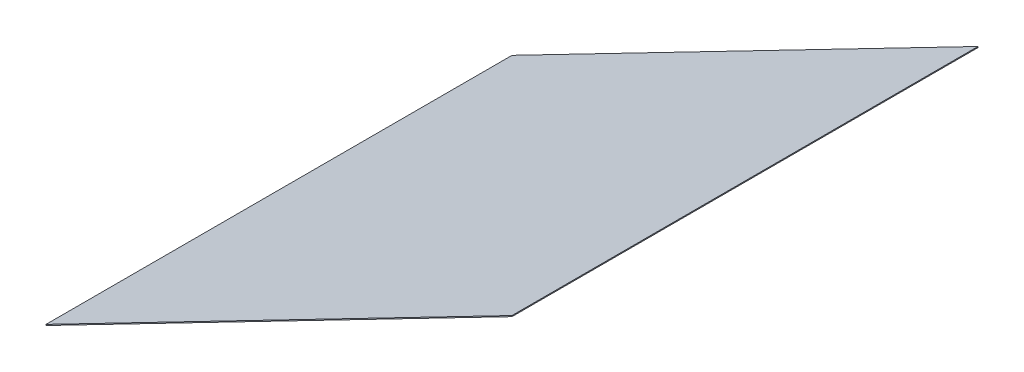
ISO-10303-21;
HEADER;
FILE_DESCRIPTION(('STEP AP214'),'2;1');
FILE_NAME('part.step','',(''),(''),'','','');
FILE_SCHEMA(('AUTOMOTIVE_DESIGN { 1 0 10303 214 1 1 1 1 }'));
ENDSEC;
DATA;
#1=APPLICATION_CONTEXT('core data for automotive mechanical design processes');
#2=APPLICATION_PROTOCOL_DEFINITION('international standard','automotive_design',2000,#1);
#3=PRODUCT_CONTEXT('',#1,'mechanical');
#4=PRODUCT('Part','Part','',(#3));
#5=PRODUCT_RELATED_PRODUCT_CATEGORY('part','',(#4));
#6=PRODUCT_DEFINITION_FORMATION('','',#4);
#7=PRODUCT_DEFINITION_CONTEXT('part definition',#1,'design');
#8=PRODUCT_DEFINITION('design','',#6,#7);
#9=PRODUCT_DEFINITION_SHAPE('','',#8);
#10=(LENGTH_UNIT() NAMED_UNIT(*) SI_UNIT(.MILLI.,.METRE.));
#11=(NAMED_UNIT(*) PLANE_ANGLE_UNIT() SI_UNIT($,.RADIAN.));
#12=(NAMED_UNIT(*) SI_UNIT($,.STERADIAN.) SOLID_ANGLE_UNIT());
#13=UNCERTAINTY_MEASURE_WITH_UNIT(LENGTH_MEASURE(1.E-05),#10,'distance_accuracy_value','');
#14=(GEOMETRIC_REPRESENTATION_CONTEXT(3) GLOBAL_UNCERTAINTY_ASSIGNED_CONTEXT((#13)) GLOBAL_UNIT_ASSIGNED_CONTEXT((#10,
#11,#12)) REPRESENTATION_CONTEXT('',''));
#15=CARTESIAN_POINT('',(0.,0.,0.));
#16=DIRECTION('',(0.,0.,1.));
#17=DIRECTION('',(1.,0.,0.));
#18=AXIS2_PLACEMENT_3D('',#15,#16,#17);
#19=CARTESIAN_POINT('',(0.,50.8,-12192.));
#20=DIRECTION('',(1.,0.,0.));
#21=DIRECTION('',(0.,0.,-1.));
#22=AXIS2_PLACEMENT_3D('',#19,#20,#21);
#23=PLANE('',#22);
#24=DIRECTION('',(0.,0.,-1.));
#25=VECTOR('',#24,1.);
#26=CARTESIAN_POINT('',(0.,4598.23678906917,-26022.0350141595));
#27=LINE('',#26,#25);
#28=CARTESIAN_POINT('',(0.,4598.23678906917,0.));
#29=VERTEX_POINT('',#28);
#30=CARTESIAN_POINT('',(0.,4598.23678906917,-12192.));
#31=VERTEX_POINT('',#30);
#32=EDGE_CURVE('E86',#29,#31,#27,.T.);
#33=ORIENTED_EDGE('',*,*,#32,.T.);
#34=DIRECTION('',(0.,-1.,0.));
#35=VECTOR('',#34,1.);
#36=CARTESIAN_POINT('',(0.,50.8,-12192.));
#37=LINE('',#36,#35);
#38=CARTESIAN_POINT('',(4.7679880361686E-12,4572.,-12192.));
#39=VERTEX_POINT('',#38);
#40=EDGE_CURVE('E37',#31,#39,#37,.T.);
#41=ORIENTED_EDGE('',*,*,#40,.T.);
#42=DIRECTION('',(0.,0.,-1.));
#43=VECTOR('',#42,1.);
#44=CARTESIAN_POINT('',(0.,4572.,-12192.));
#45=LINE('',#44,#43);
#46=CARTESIAN_POINT('',(0.,4572.,0.));
#47=VERTEX_POINT('',#46);
#48=EDGE_CURVE('E77',#47,#39,#45,.T.);
#49=ORIENTED_EDGE('',*,*,#48,.F.);
#50=DIRECTION('',(0.,-1.,0.));
#51=VECTOR('',#50,1.);
#52=CARTESIAN_POINT('',(0.,50.8,0.));
#53=LINE('',#52,#51);
#54=EDGE_CURVE('E92',#29,#47,#53,.T.);
#55=ORIENTED_EDGE('',*,*,#54,.F.);
#56=EDGE_LOOP('',(#33,#41,#49,#55));
#57=FACE_BOUND('',#56,.T.);
#58=ADVANCED_FACE('F34',(#57),#23,.F.);
#59=CARTESIAN_POINT('',(12192.,10868.8293766007,-12192.));
#60=DIRECTION('',(0.,0.,1.));
#61=DIRECTION('',(1.,0.,0.));
#62=AXIS2_PLACEMENT_3D('',#59,#60,#61);
#63=PLANE('',#62);
#64=DIRECTION('',(0.888496348848055,0.458883686879013,0.));
#65=VECTOR('',#64,1.);
#66=CARTESIAN_POINT('',(0.,4572.,-12192.));
#67=LINE('',#66,#65);
#68=CARTESIAN_POINT('',(12192.,10868.8293766007,-12192.));
#69=VERTEX_POINT('',#68);
#70=EDGE_CURVE('E81',#39,#69,#67,.T.);
#71=ORIENTED_EDGE('',*,*,#70,.F.);
#72=ORIENTED_EDGE('',*,*,#40,.F.);
#73=DIRECTION('',(0.888496348848055,0.458883686879013,0.));
#74=VECTOR('',#73,1.);
#75=CARTESIAN_POINT('',(-50.8,4572.,-12192.));
#76=LINE('',#75,#74);
#77=CARTESIAN_POINT('',(12192.,10895.0661656699,-12192.));
#78=VERTEX_POINT('',#77);
#79=EDGE_CURVE('E96',#31,#78,#76,.T.);
#80=ORIENTED_EDGE('',*,*,#79,.T.);
#81=DIRECTION('',(0.,1.,0.));
#82=VECTOR('',#81,1.);
#83=CARTESIAN_POINT('',(12192.,50.8,-12192.));
#84=LINE('',#83,#82);
#85=EDGE_CURVE('E91',#69,#78,#84,.T.);
#86=ORIENTED_EDGE('',*,*,#85,.F.);
#87=EDGE_LOOP('',(#71,#72,#80,#86));
#88=FACE_BOUND('',#87,.T.);
#89=ADVANCED_FACE('F90',(#88),#63,.F.);
#90=CARTESIAN_POINT('',(12192.,50.8,0.));
#91=DIRECTION('',(-1.,0.,0.));
#92=DIRECTION('',(0.,0.,1.));
#93=AXIS2_PLACEMENT_3D('',#90,#91,#92);
#94=PLANE('',#93);
#95=DIRECTION('',(0.,0.,1.));
#96=VECTOR('',#95,1.);
#97=CARTESIAN_POINT('',(12192.,10868.8293766007,-26022.0350141595));
#98=LINE('',#97,#96);
#99=CARTESIAN_POINT('',(12192.,10868.8293766007,0.));
#100=VERTEX_POINT('',#99);
#101=EDGE_CURVE('E50',#69,#100,#98,.T.);
#102=ORIENTED_EDGE('',*,*,#101,.F.);
#103=ORIENTED_EDGE('',*,*,#85,.T.);
#104=DIRECTION('',(0.,0.,1.));
#105=VECTOR('',#104,1.);
#106=CARTESIAN_POINT('',(12192.,10895.0661656699,-26022.0350141595));
#107=LINE('',#106,#105);
#108=CARTESIAN_POINT('',(12192.,10895.0661656699,0.));
#109=VERTEX_POINT('',#108);
#110=EDGE_CURVE('E58',#78,#109,#107,.T.);
#111=ORIENTED_EDGE('',*,*,#110,.T.);
#112=DIRECTION('',(0.,1.,0.));
#113=VECTOR('',#112,1.);
#114=CARTESIAN_POINT('',(12192.,10868.8293766007,0.));
#115=LINE('',#114,#113);
#116=EDGE_CURVE('E101',#100,#109,#115,.T.);
#117=ORIENTED_EDGE('',*,*,#116,.F.);
#118=EDGE_LOOP('',(#102,#103,#111,#117));
#119=FACE_BOUND('',#118,.T.);
#120=ADVANCED_FACE('F106',(#119),#94,.F.);
#121=CARTESIAN_POINT('',(0.,50.8,0.));
#122=DIRECTION('',(0.,0.,-1.));
#123=DIRECTION('',(-1.,0.,0.));
#124=AXIS2_PLACEMENT_3D('',#121,#122,#123);
#125=PLANE('',#124);
#126=DIRECTION('',(-0.888496348848055,-0.458883686879013,0.));
#127=VECTOR('',#126,1.);
#128=CARTESIAN_POINT('',(-50.8,4572.,0.));
#129=LINE('',#128,#127);
#130=EDGE_CURVE('E11',#109,#29,#129,.T.);
#131=ORIENTED_EDGE('',*,*,#130,.T.);
#132=ORIENTED_EDGE('',*,*,#54,.T.);
#133=DIRECTION('',(0.888496348848055,0.458883686879013,0.));
#134=VECTOR('',#133,1.);
#135=CARTESIAN_POINT('',(0.,4572.,0.));
#136=LINE('',#135,#134);
#137=EDGE_CURVE('E42',#47,#100,#136,.T.);
#138=ORIENTED_EDGE('',*,*,#137,.T.);
#139=ORIENTED_EDGE('',*,*,#116,.T.);
#140=EDGE_LOOP('',(#131,#132,#138,#139));
#141=FACE_BOUND('',#140,.T.);
#142=ADVANCED_FACE('F105',(#141),#125,.F.);
#143=CARTESIAN_POINT('',(-50.8,4572.,-26022.0350141595));
#144=DIRECTION('',(-0.458883686879013,0.888496348848055,0.));
#145=DIRECTION('',(-0.888496348848055,-0.458883686879013,0.));
#146=AXIS2_PLACEMENT_3D('',#143,#144,#145);
#147=PLANE('',#146);
#148=ORIENTED_EDGE('',*,*,#79,.F.);
#149=ORIENTED_EDGE('',*,*,#32,.F.);
#150=ORIENTED_EDGE('',*,*,#130,.F.);
#151=ORIENTED_EDGE('',*,*,#110,.F.);
#152=EDGE_LOOP('',(#148,#149,#150,#151));
#153=FACE_BOUND('',#152,.T.);
#154=ADVANCED_FACE('F108',(#153),#147,.T.);
#155=CARTESIAN_POINT('',(0.,4572.,-26022.0350141595));
#156=DIRECTION('',(0.458883686879013,-0.888496348848055,0.));
#157=DIRECTION('',(0.888496348848055,0.458883686879013,0.));
#158=AXIS2_PLACEMENT_3D('',#155,#156,#157);
#159=PLANE('',#158);
#160=ORIENTED_EDGE('',*,*,#48,.T.);
#161=ORIENTED_EDGE('',*,*,#70,.T.);
#162=ORIENTED_EDGE('',*,*,#101,.T.);
#163=ORIENTED_EDGE('',*,*,#137,.F.);
#164=EDGE_LOOP('',(#160,#161,#162,#163));
#165=FACE_BOUND('',#164,.T.);
#166=ADVANCED_FACE('F79',(#165),#159,.T.);
#167=CLOSED_SHELL('',(#58,#89,#120,#142,#154,#166));
#168=MANIFOLD_SOLID_BREP('B2',#167);
#169=ADVANCED_BREP_SHAPE_REPRESENTATION('',(#18,#168),#14);
#170=SHAPE_DEFINITION_REPRESENTATION(#9,#169);
ENDSEC;
END-ISO-10303-21;
